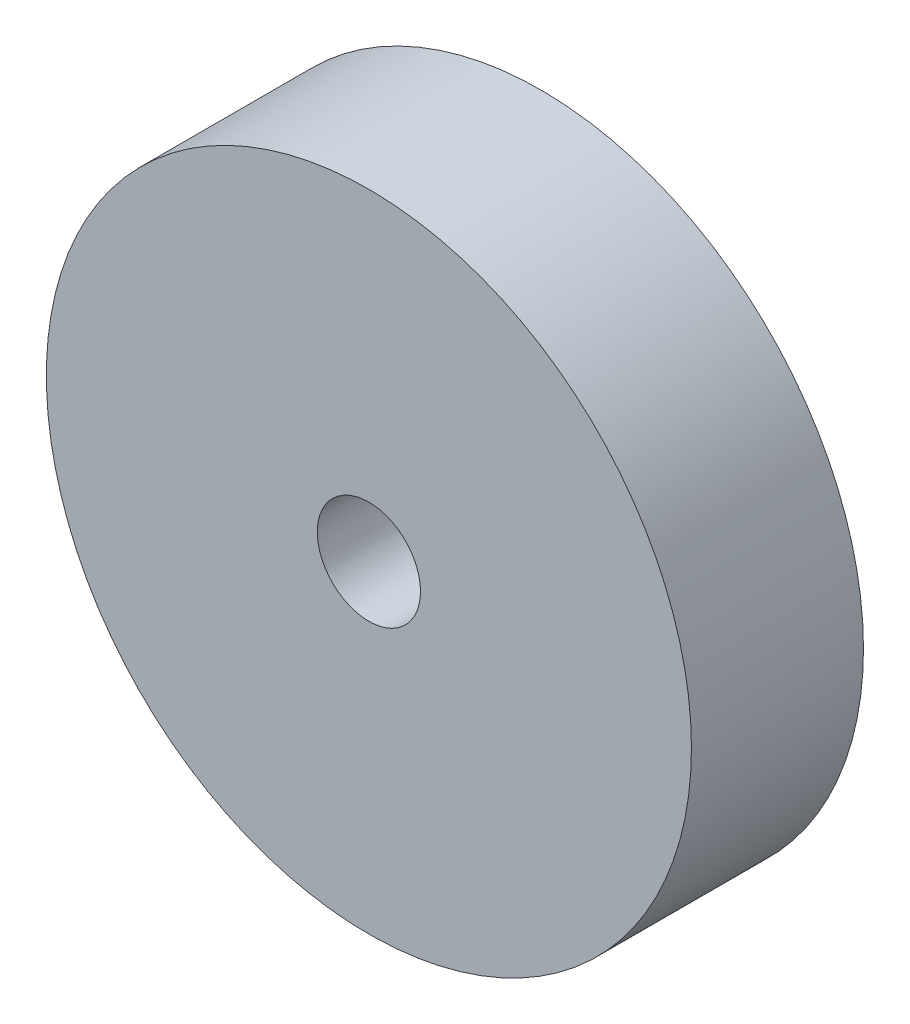
ISO-10303-21;
HEADER;
FILE_DESCRIPTION(('STEP AP214'),'2;1');
FILE_NAME('part.step','',(''),(''),'','','');
FILE_SCHEMA(('AUTOMOTIVE_DESIGN { 1 0 10303 214 1 1 1 1 }'));
ENDSEC;
DATA;
#1=APPLICATION_CONTEXT('core data for automotive mechanical design processes');
#2=APPLICATION_PROTOCOL_DEFINITION('international standard','automotive_design',2000,#1);
#3=PRODUCT_CONTEXT('',#1,'mechanical');
#4=PRODUCT('Part','Part','',(#3));
#5=PRODUCT_RELATED_PRODUCT_CATEGORY('part','',(#4));
#6=PRODUCT_DEFINITION_FORMATION('','',#4);
#7=PRODUCT_DEFINITION_CONTEXT('part definition',#1,'design');
#8=PRODUCT_DEFINITION('design','',#6,#7);
#9=PRODUCT_DEFINITION_SHAPE('','',#8);
#10=(LENGTH_UNIT() NAMED_UNIT(*) SI_UNIT(.MILLI.,.METRE.));
#11=(NAMED_UNIT(*) PLANE_ANGLE_UNIT() SI_UNIT($,.RADIAN.));
#12=(NAMED_UNIT(*) SI_UNIT($,.STERADIAN.) SOLID_ANGLE_UNIT());
#13=UNCERTAINTY_MEASURE_WITH_UNIT(LENGTH_MEASURE(1.E-05),#10,'distance_accuracy_value','');
#14=(GEOMETRIC_REPRESENTATION_CONTEXT(3) GLOBAL_UNCERTAINTY_ASSIGNED_CONTEXT((#13)) GLOBAL_UNIT_ASSIGNED_CONTEXT((#10,
#11,#12)) REPRESENTATION_CONTEXT('',''));
#15=CARTESIAN_POINT('',(0.,0.,0.));
#16=DIRECTION('',(0.,0.,1.));
#17=DIRECTION('',(1.,0.,0.));
#18=AXIS2_PLACEMENT_3D('',#15,#16,#17);
#19=CARTESIAN_POINT('',(0.,0.,10.));
#20=DIRECTION('',(0.,0.,1.));
#21=DIRECTION('',(1.,0.,0.));
#22=AXIS2_PLACEMENT_3D('',#19,#20,#21);
#23=PLANE('',#22);
#24=CARTESIAN_POINT('',(0.,0.,10.));
#25=DIRECTION('',(0.,0.,1.));
#26=DIRECTION('',(1.,0.,0.));
#27=AXIS2_PLACEMENT_3D('',#24,#25,#26);
#28=CIRCLE('',#27,37.5);
#29=CARTESIAN_POINT('',(37.5,0.,10.));
#30=VERTEX_POINT('',#29);
#31=EDGE_CURVE('E10',#30,#30,#28,.T.);
#32=ORIENTED_EDGE('',*,*,#31,.T.);
#33=EDGE_LOOP('',(#32));
#34=FACE_BOUND('',#33,.T.);
#35=CARTESIAN_POINT('',(0.,0.,10.));
#36=DIRECTION('',(0.,0.,1.));
#37=DIRECTION('',(1.,0.,0.));
#38=AXIS2_PLACEMENT_3D('',#35,#36,#37);
#39=CIRCLE('',#38,6.);
#40=CARTESIAN_POINT('',(6.,0.,10.));
#41=VERTEX_POINT('',#40);
#42=EDGE_CURVE('E47',#41,#41,#39,.T.);
#43=ORIENTED_EDGE('',*,*,#42,.F.);
#44=EDGE_LOOP('',(#43));
#45=FACE_BOUND('',#44,.T.);
#46=ADVANCED_FACE('F33',(#34,#45),#23,.T.);
#47=CARTESIAN_POINT('',(0.,0.,-10.));
#48=DIRECTION('',(0.,0.,1.));
#49=DIRECTION('',(1.,0.,0.));
#50=AXIS2_PLACEMENT_3D('',#47,#48,#49);
#51=PLANE('',#50);
#52=CARTESIAN_POINT('',(0.,0.,-10.));
#53=DIRECTION('',(0.,0.,1.));
#54=DIRECTION('',(1.,0.,0.));
#55=AXIS2_PLACEMENT_3D('',#52,#53,#54);
#56=CIRCLE('',#55,37.5);
#57=CARTESIAN_POINT('',(37.5,0.,-10.));
#58=VERTEX_POINT('',#57);
#59=EDGE_CURVE('E37',#58,#58,#56,.T.);
#60=ORIENTED_EDGE('',*,*,#59,.F.);
#61=EDGE_LOOP('',(#60));
#62=FACE_BOUND('',#61,.T.);
#63=CARTESIAN_POINT('',(0.,0.,-10.));
#64=DIRECTION('',(0.,0.,1.));
#65=DIRECTION('',(1.,0.,0.));
#66=AXIS2_PLACEMENT_3D('',#63,#64,#65);
#67=CIRCLE('',#66,6.);
#68=CARTESIAN_POINT('',(6.,0.,-10.));
#69=VERTEX_POINT('',#68);
#70=EDGE_CURVE('E49',#69,#69,#67,.T.);
#71=ORIENTED_EDGE('',*,*,#70,.T.);
#72=EDGE_LOOP('',(#71));
#73=FACE_BOUND('',#72,.T.);
#74=ADVANCED_FACE('F60',(#62,#73),#51,.F.);
#75=CARTESIAN_POINT('',(0.,0.,10.));
#76=DIRECTION('',(0.,0.,-1.));
#77=DIRECTION('',(-1.,0.,0.));
#78=AXIS2_PLACEMENT_3D('',#75,#76,#77);
#79=CYLINDRICAL_SURFACE('',#78,37.5);
#80=ORIENTED_EDGE('',*,*,#31,.F.);
#81=EDGE_LOOP('',(#80));
#82=FACE_BOUND('',#81,.T.);
#83=ORIENTED_EDGE('',*,*,#59,.T.);
#84=EDGE_LOOP('',(#83));
#85=FACE_BOUND('',#84,.T.);
#86=ADVANCED_FACE('F35',(#82,#85),#79,.T.);
#87=CARTESIAN_POINT('',(0.,0.,10.));
#88=DIRECTION('',(0.,0.,-1.));
#89=DIRECTION('',(-1.,0.,0.));
#90=AXIS2_PLACEMENT_3D('',#87,#88,#89);
#91=CYLINDRICAL_SURFACE('',#90,6.);
#92=ORIENTED_EDGE('',*,*,#42,.T.);
#93=EDGE_LOOP('',(#92));
#94=FACE_BOUND('',#93,.T.);
#95=ORIENTED_EDGE('',*,*,#70,.F.);
#96=EDGE_LOOP('',(#95));
#97=FACE_BOUND('',#96,.T.);
#98=ADVANCED_FACE('F56',(#94,#97),#91,.F.);
#99=CLOSED_SHELL('',(#46,#74,#86,#98));
#100=MANIFOLD_SOLID_BREP('B2',#99);
#101=ADVANCED_BREP_SHAPE_REPRESENTATION('',(#18,#100),#14);
#102=SHAPE_DEFINITION_REPRESENTATION(#9,#101);
ENDSEC;
END-ISO-10303-21;
